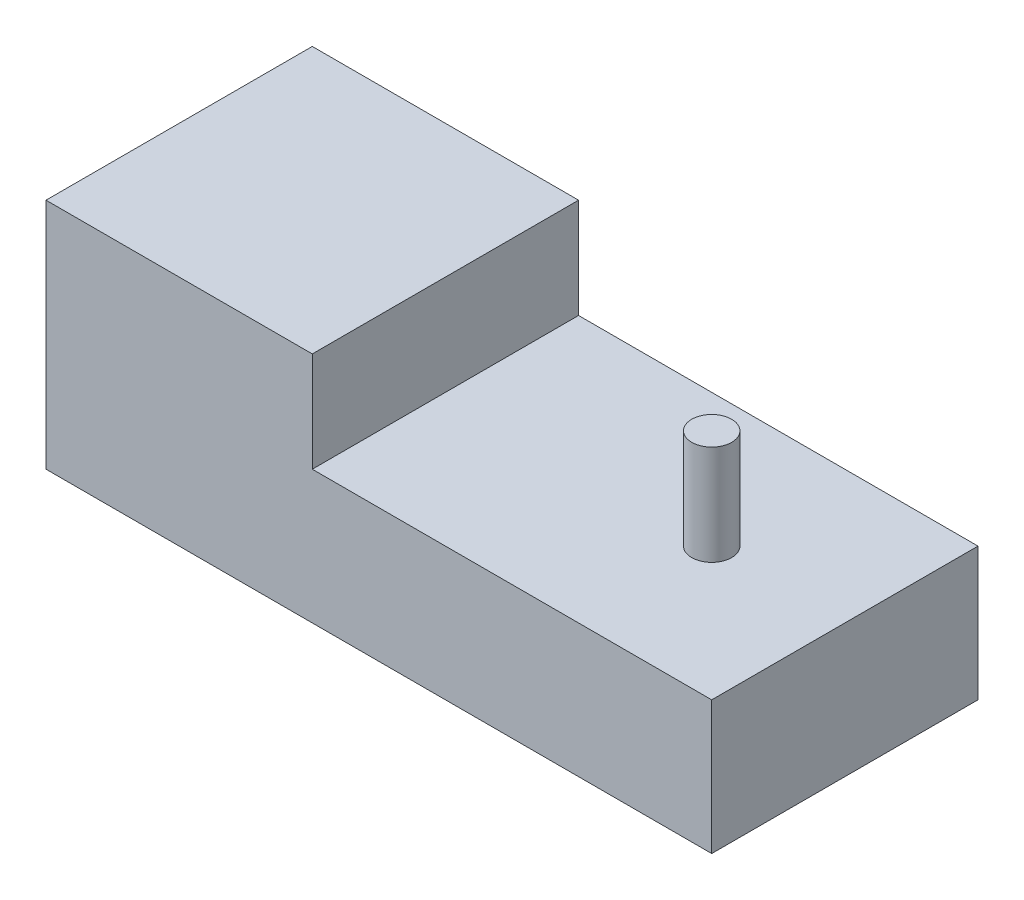
ISO-10303-21;
HEADER;
FILE_DESCRIPTION(('STEP AP214'),'2;1');
FILE_NAME('part.step','',(''),(''),'','','');
FILE_SCHEMA(('AUTOMOTIVE_DESIGN { 1 0 10303 214 1 1 1 1 }'));
ENDSEC;
DATA;
#1=APPLICATION_CONTEXT('core data for automotive mechanical design processes');
#2=APPLICATION_PROTOCOL_DEFINITION('international standard','automotive_design',2000,#1);
#3=PRODUCT_CONTEXT('',#1,'mechanical');
#4=PRODUCT('Part','Part','',(#3));
#5=PRODUCT_RELATED_PRODUCT_CATEGORY('part','',(#4));
#6=PRODUCT_DEFINITION_FORMATION('','',#4);
#7=PRODUCT_DEFINITION_CONTEXT('part definition',#1,'design');
#8=PRODUCT_DEFINITION('design','',#6,#7);
#9=PRODUCT_DEFINITION_SHAPE('','',#8);
#10=(LENGTH_UNIT() NAMED_UNIT(*) SI_UNIT(.MILLI.,.METRE.));
#11=(NAMED_UNIT(*) PLANE_ANGLE_UNIT() SI_UNIT($,.RADIAN.));
#12=(NAMED_UNIT(*) SI_UNIT($,.STERADIAN.) SOLID_ANGLE_UNIT());
#13=UNCERTAINTY_MEASURE_WITH_UNIT(LENGTH_MEASURE(1.E-05),#10,'distance_accuracy_value','');
#14=(GEOMETRIC_REPRESENTATION_CONTEXT(3) GLOBAL_UNCERTAINTY_ASSIGNED_CONTEXT((#13)) GLOBAL_UNIT_ASSIGNED_CONTEXT((#10,
#11,#12)) REPRESENTATION_CONTEXT('',''));
#15=CARTESIAN_POINT('',(0.,0.,0.));
#16=DIRECTION('',(0.,0.,1.));
#17=DIRECTION('',(1.,0.,0.));
#18=AXIS2_PLACEMENT_3D('',#15,#16,#17);
#19=CARTESIAN_POINT('',(0.,20.,0.));
#20=DIRECTION('',(0.,-1.,0.));
#21=DIRECTION('',(0.,0.,-1.));
#22=AXIS2_PLACEMENT_3D('',#19,#20,#21);
#23=PLANE('',#22);
#24=CARTESIAN_POINT('',(80.,20.,-20.));
#25=DIRECTION('',(0.,-1.,0.));
#26=DIRECTION('',(0.,0.,-1.));
#27=AXIS2_PLACEMENT_3D('',#24,#25,#26);
#28=CIRCLE('',#27,3.00000000000001);
#29=CARTESIAN_POINT('',(80.,20.,-23.));
#30=VERTEX_POINT('',#29);
#31=EDGE_CURVE('E11',#30,#30,#28,.F.);
#32=ORIENTED_EDGE('',*,*,#31,.F.);
#33=EDGE_LOOP('',(#32));
#34=FACE_BOUND('',#33,.T.);
#35=DIRECTION('',(0.,0.,-1.));
#36=VECTOR('',#35,1.);
#37=CARTESIAN_POINT('',(40.,20.,0.));
#38=LINE('',#37,#36);
#39=CARTESIAN_POINT('',(40.,20.,0.));
#40=VERTEX_POINT('',#39);
#41=CARTESIAN_POINT('',(40.,20.,-40.));
#42=VERTEX_POINT('',#41);
#43=EDGE_CURVE('E64',#40,#42,#38,.T.);
#44=ORIENTED_EDGE('',*,*,#43,.F.);
#45=DIRECTION('',(1.,0.,0.));
#46=VECTOR('',#45,1.);
#47=CARTESIAN_POINT('',(0.,20.,0.));
#48=LINE('',#47,#46);
#49=CARTESIAN_POINT('',(100.,20.,0.));
#50=VERTEX_POINT('',#49);
#51=EDGE_CURVE('E130',#40,#50,#48,.T.);
#52=ORIENTED_EDGE('',*,*,#51,.T.);
#53=DIRECTION('',(0.,0.,-1.));
#54=VECTOR('',#53,1.);
#55=CARTESIAN_POINT('',(100.,20.,0.));
#56=LINE('',#55,#54);
#57=CARTESIAN_POINT('',(100.,20.,-40.));
#58=VERTEX_POINT('',#57);
#59=EDGE_CURVE('E132',#50,#58,#56,.T.);
#60=ORIENTED_EDGE('',*,*,#59,.T.);
#61=DIRECTION('',(-1.,0.,0.));
#62=VECTOR('',#61,1.);
#63=CARTESIAN_POINT('',(0.,20.,-40.));
#64=LINE('',#63,#62);
#65=EDGE_CURVE('E60',#58,#42,#64,.T.);
#66=ORIENTED_EDGE('',*,*,#65,.T.);
#67=EDGE_LOOP('',(#44,#52,#60,#66));
#68=FACE_BOUND('',#67,.T.);
#69=ADVANCED_FACE('F45',(#34,#68),#23,.F.);
#70=CARTESIAN_POINT('',(0.,20.,0.));
#71=DIRECTION('',(1.,0.,0.));
#72=DIRECTION('',(0.,0.,-1.));
#73=AXIS2_PLACEMENT_3D('',#70,#71,#72);
#74=PLANE('',#73);
#75=DIRECTION('',(0.,0.,1.));
#76=VECTOR('',#75,1.);
#77=CARTESIAN_POINT('',(0.,0.,0.));
#78=LINE('',#77,#76);
#79=CARTESIAN_POINT('',(0.,0.,-40.));
#80=VERTEX_POINT('',#79);
#81=CARTESIAN_POINT('',(0.,0.,0.));
#82=VERTEX_POINT('',#81);
#83=EDGE_CURVE('E102',#80,#82,#78,.T.);
#84=ORIENTED_EDGE('',*,*,#83,.T.);
#85=DIRECTION('',(0.,-1.,0.));
#86=VECTOR('',#85,1.);
#87=CARTESIAN_POINT('',(0.,20.,0.));
#88=LINE('',#87,#86);
#89=CARTESIAN_POINT('',(0.,35.,0.));
#90=VERTEX_POINT('',#89);
#91=EDGE_CURVE('E53',#90,#82,#88,.T.);
#92=ORIENTED_EDGE('',*,*,#91,.F.);
#93=DIRECTION('',(0.,0.,1.));
#94=VECTOR('',#93,1.);
#95=CARTESIAN_POINT('',(0.,35.,0.));
#96=LINE('',#95,#94);
#97=CARTESIAN_POINT('',(0.,35.,-40.));
#98=VERTEX_POINT('',#97);
#99=EDGE_CURVE('E100',#98,#90,#96,.T.);
#100=ORIENTED_EDGE('',*,*,#99,.F.);
#101=DIRECTION('',(0.,-1.,0.));
#102=VECTOR('',#101,1.);
#103=CARTESIAN_POINT('',(0.,20.,-40.));
#104=LINE('',#103,#102);
#105=EDGE_CURVE('E136',#98,#80,#104,.T.);
#106=ORIENTED_EDGE('',*,*,#105,.T.);
#107=EDGE_LOOP('',(#84,#92,#100,#106));
#108=FACE_BOUND('',#107,.T.);
#109=ADVANCED_FACE('F47',(#108),#74,.F.);
#110=CARTESIAN_POINT('',(0.,20.,0.));
#111=DIRECTION('',(0.,0.,-1.));
#112=DIRECTION('',(-1.,0.,0.));
#113=AXIS2_PLACEMENT_3D('',#110,#111,#112);
#114=PLANE('',#113);
#115=DIRECTION('',(1.,0.,0.));
#116=VECTOR('',#115,1.);
#117=CARTESIAN_POINT('',(0.,0.,0.));
#118=LINE('',#117,#116);
#119=CARTESIAN_POINT('',(100.,0.,0.));
#120=VERTEX_POINT('',#119);
#121=EDGE_CURVE('E138',#82,#120,#118,.T.);
#122=ORIENTED_EDGE('',*,*,#121,.T.);
#123=DIRECTION('',(0.,-1.,0.));
#124=VECTOR('',#123,1.);
#125=CARTESIAN_POINT('',(100.,20.,0.));
#126=LINE('',#125,#124);
#127=EDGE_CURVE('E104',#50,#120,#126,.T.);
#128=ORIENTED_EDGE('',*,*,#127,.F.);
#129=ORIENTED_EDGE('',*,*,#51,.F.);
#130=DIRECTION('',(0.,-1.,0.));
#131=VECTOR('',#130,1.);
#132=CARTESIAN_POINT('',(40.,35.,0.));
#133=LINE('',#132,#131);
#134=CARTESIAN_POINT('',(40.,35.,0.));
#135=VERTEX_POINT('',#134);
#136=EDGE_CURVE('E109',#135,#40,#133,.T.);
#137=ORIENTED_EDGE('',*,*,#136,.F.);
#138=DIRECTION('',(1.,0.,0.));
#139=VECTOR('',#138,1.);
#140=CARTESIAN_POINT('',(0.,35.,0.));
#141=LINE('',#140,#139);
#142=EDGE_CURVE('E106',#90,#135,#141,.T.);
#143=ORIENTED_EDGE('',*,*,#142,.F.);
#144=ORIENTED_EDGE('',*,*,#91,.T.);
#145=EDGE_LOOP('',(#122,#128,#129,#137,#143,#144));
#146=FACE_BOUND('',#145,.T.);
#147=ADVANCED_FACE('F107',(#146),#114,.F.);
#148=CARTESIAN_POINT('',(100.,20.,0.));
#149=DIRECTION('',(-1.,0.,0.));
#150=DIRECTION('',(0.,0.,1.));
#151=AXIS2_PLACEMENT_3D('',#148,#149,#150);
#152=PLANE('',#151);
#153=DIRECTION('',(0.,0.,-1.));
#154=VECTOR('',#153,1.);
#155=CARTESIAN_POINT('',(100.,0.,0.));
#156=LINE('',#155,#154);
#157=CARTESIAN_POINT('',(100.,0.,-40.));
#158=VERTEX_POINT('',#157);
#159=EDGE_CURVE('E140',#120,#158,#156,.T.);
#160=ORIENTED_EDGE('',*,*,#159,.T.);
#161=DIRECTION('',(0.,-1.,0.));
#162=VECTOR('',#161,1.);
#163=CARTESIAN_POINT('',(100.,20.,-40.));
#164=LINE('',#163,#162);
#165=EDGE_CURVE('E144',#58,#158,#164,.T.);
#166=ORIENTED_EDGE('',*,*,#165,.F.);
#167=ORIENTED_EDGE('',*,*,#59,.F.);
#168=ORIENTED_EDGE('',*,*,#127,.T.);
#169=EDGE_LOOP('',(#160,#166,#167,#168));
#170=FACE_BOUND('',#169,.T.);
#171=ADVANCED_FACE('F152',(#170),#152,.F.);
#172=CARTESIAN_POINT('',(0.,20.,-40.));
#173=DIRECTION('',(0.,0.,1.));
#174=DIRECTION('',(1.,0.,0.));
#175=AXIS2_PLACEMENT_3D('',#172,#173,#174);
#176=PLANE('',#175);
#177=DIRECTION('',(-1.,0.,0.));
#178=VECTOR('',#177,1.);
#179=CARTESIAN_POINT('',(0.,0.,-40.));
#180=LINE('',#179,#178);
#181=EDGE_CURVE('E133',#158,#80,#180,.T.);
#182=ORIENTED_EDGE('',*,*,#181,.T.);
#183=ORIENTED_EDGE('',*,*,#105,.F.);
#184=DIRECTION('',(-1.,0.,0.));
#185=VECTOR('',#184,1.);
#186=CARTESIAN_POINT('',(0.,35.,-40.));
#187=LINE('',#186,#185);
#188=CARTESIAN_POINT('',(40.,35.,-40.));
#189=VERTEX_POINT('',#188);
#190=EDGE_CURVE('E117',#189,#98,#187,.T.);
#191=ORIENTED_EDGE('',*,*,#190,.F.);
#192=DIRECTION('',(0.,-1.,0.));
#193=VECTOR('',#192,1.);
#194=CARTESIAN_POINT('',(40.,35.,-40.));
#195=LINE('',#194,#193);
#196=EDGE_CURVE('E122',#189,#42,#195,.T.);
#197=ORIENTED_EDGE('',*,*,#196,.T.);
#198=ORIENTED_EDGE('',*,*,#65,.F.);
#199=ORIENTED_EDGE('',*,*,#165,.T.);
#200=EDGE_LOOP('',(#182,#183,#191,#197,#198,#199));
#201=FACE_BOUND('',#200,.T.);
#202=ADVANCED_FACE('F158',(#201),#176,.F.);
#203=CARTESIAN_POINT('',(0.,0.,0.));
#204=DIRECTION('',(0.,-1.,0.));
#205=DIRECTION('',(0.,0.,-1.));
#206=AXIS2_PLACEMENT_3D('',#203,#204,#205);
#207=PLANE('',#206);
#208=ORIENTED_EDGE('',*,*,#83,.F.);
#209=ORIENTED_EDGE('',*,*,#181,.F.);
#210=ORIENTED_EDGE('',*,*,#159,.F.);
#211=ORIENTED_EDGE('',*,*,#121,.F.);
#212=EDGE_LOOP('',(#208,#209,#210,#211));
#213=FACE_BOUND('',#212,.T.);
#214=ADVANCED_FACE('F156',(#213),#207,.T.);
#215=CARTESIAN_POINT('',(80.,35.,-20.));
#216=DIRECTION('',(0.,-1.,0.));
#217=DIRECTION('',(0.,0.,-1.));
#218=AXIS2_PLACEMENT_3D('',#215,#216,#217);
#219=CYLINDRICAL_SURFACE('',#218,3.00000000000001);
#220=CARTESIAN_POINT('',(80.,35.,-20.));
#221=DIRECTION('',(0.,1.,0.));
#222=DIRECTION('',(0.,0.,1.));
#223=AXIS2_PLACEMENT_3D('',#220,#221,#222);
#224=CIRCLE('',#223,3.00000000000001);
#225=CARTESIAN_POINT('',(80.,35.,-17.));
#226=VERTEX_POINT('',#225);
#227=EDGE_CURVE('E127',#226,#226,#224,.T.);
#228=ORIENTED_EDGE('',*,*,#227,.F.);
#229=EDGE_LOOP('',(#228));
#230=FACE_BOUND('',#229,.T.);
#231=ORIENTED_EDGE('',*,*,#31,.T.);
#232=EDGE_LOOP('',(#231));
#233=FACE_BOUND('',#232,.T.);
#234=ADVANCED_FACE('F171',(#230,#233),#219,.T.);
#235=CARTESIAN_POINT('',(80.,35.,-20.));
#236=DIRECTION('',(0.,1.,0.));
#237=DIRECTION('',(0.,0.,1.));
#238=AXIS2_PLACEMENT_3D('',#235,#236,#237);
#239=PLANE('',#238);
#240=ORIENTED_EDGE('',*,*,#227,.T.);
#241=EDGE_LOOP('',(#240));
#242=FACE_BOUND('',#241,.T.);
#243=ADVANCED_FACE('F163',(#242),#239,.T.);
#244=CARTESIAN_POINT('',(40.,35.,0.));
#245=DIRECTION('',(-1.,0.,0.));
#246=DIRECTION('',(0.,0.,1.));
#247=AXIS2_PLACEMENT_3D('',#244,#245,#246);
#248=PLANE('',#247);
#249=ORIENTED_EDGE('',*,*,#43,.T.);
#250=ORIENTED_EDGE('',*,*,#196,.F.);
#251=DIRECTION('',(0.,0.,-1.));
#252=VECTOR('',#251,1.);
#253=CARTESIAN_POINT('',(40.,35.,0.));
#254=LINE('',#253,#252);
#255=EDGE_CURVE('E112',#135,#189,#254,.T.);
#256=ORIENTED_EDGE('',*,*,#255,.F.);
#257=ORIENTED_EDGE('',*,*,#136,.T.);
#258=EDGE_LOOP('',(#249,#250,#256,#257));
#259=FACE_BOUND('',#258,.T.);
#260=ADVANCED_FACE('F161',(#259),#248,.F.);
#261=CARTESIAN_POINT('',(0.,35.,0.));
#262=DIRECTION('',(0.,-1.,0.));
#263=DIRECTION('',(0.,0.,-1.));
#264=AXIS2_PLACEMENT_3D('',#261,#262,#263);
#265=PLANE('',#264);
#266=ORIENTED_EDGE('',*,*,#99,.T.);
#267=ORIENTED_EDGE('',*,*,#142,.T.);
#268=ORIENTED_EDGE('',*,*,#255,.T.);
#269=ORIENTED_EDGE('',*,*,#190,.T.);
#270=EDGE_LOOP('',(#266,#267,#268,#269));
#271=FACE_BOUND('',#270,.T.);
#272=ADVANCED_FACE('F115',(#271),#265,.F.);
#273=CLOSED_SHELL('',(#69,#109,#147,#171,#202,#214,#234,#243,#260,#272));
#274=MANIFOLD_SOLID_BREP('B2',#273);
#275=ADVANCED_BREP_SHAPE_REPRESENTATION('',(#18,#274),#14);
#276=SHAPE_DEFINITION_REPRESENTATION(#9,#275);
ENDSEC;
END-ISO-10303-21;
